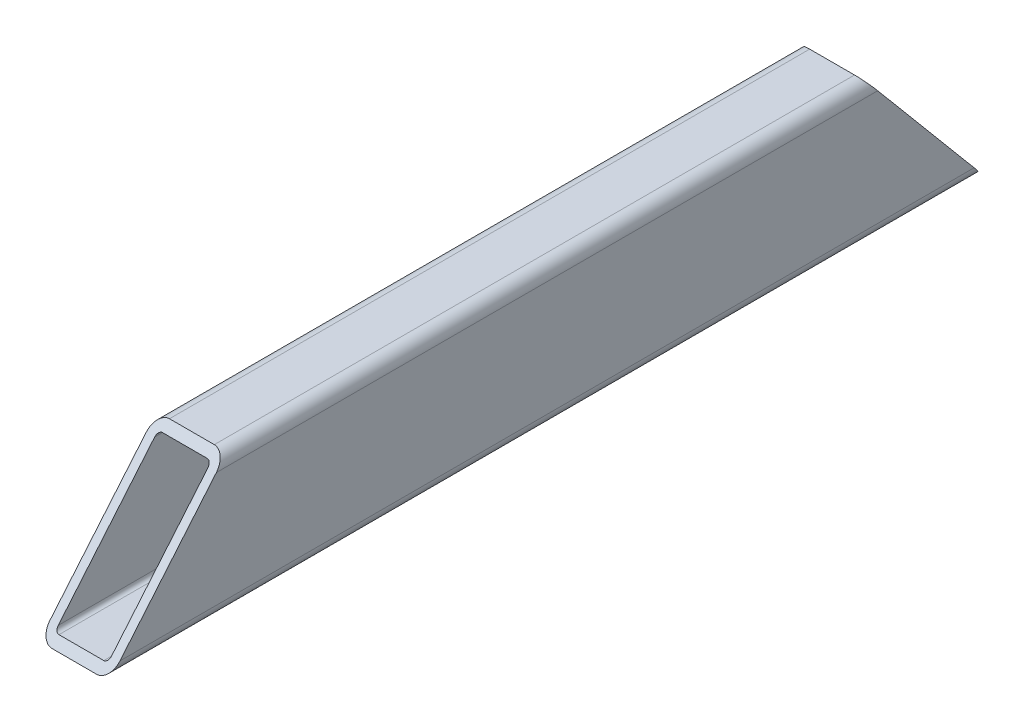
ISO-10303-21;
HEADER;
FILE_DESCRIPTION(('STEP AP214'),'2;1');
FILE_NAME('part.step','',(''),(''),'','','');
FILE_SCHEMA(('AUTOMOTIVE_DESIGN { 1 0 10303 214 1 1 1 1 }'));
ENDSEC;
DATA;
#1=APPLICATION_CONTEXT('core data for automotive mechanical design processes');
#2=APPLICATION_PROTOCOL_DEFINITION('international standard','automotive_design',2000,#1);
#3=PRODUCT_CONTEXT('',#1,'mechanical');
#4=PRODUCT('Part','Part','',(#3));
#5=PRODUCT_RELATED_PRODUCT_CATEGORY('part','',(#4));
#6=PRODUCT_DEFINITION_FORMATION('','',#4);
#7=PRODUCT_DEFINITION_CONTEXT('part definition',#1,'design');
#8=PRODUCT_DEFINITION('design','',#6,#7);
#9=PRODUCT_DEFINITION_SHAPE('','',#8);
#10=(LENGTH_UNIT() NAMED_UNIT(*) SI_UNIT(.MILLI.,.METRE.));
#11=(NAMED_UNIT(*) PLANE_ANGLE_UNIT() SI_UNIT($,.RADIAN.));
#12=(NAMED_UNIT(*) SI_UNIT($,.STERADIAN.) SOLID_ANGLE_UNIT());
#13=UNCERTAINTY_MEASURE_WITH_UNIT(LENGTH_MEASURE(1.E-05),#10,'distance_accuracy_value','');
#14=(GEOMETRIC_REPRESENTATION_CONTEXT(3) GLOBAL_UNCERTAINTY_ASSIGNED_CONTEXT((#13)) GLOBAL_UNIT_ASSIGNED_CONTEXT((#10,
#11,#12)) REPRESENTATION_CONTEXT('',''));
#15=CARTESIAN_POINT('',(0.,0.,0.));
#16=DIRECTION('',(0.,0.,1.));
#17=DIRECTION('',(1.,0.,0.));
#18=AXIS2_PLACEMENT_3D('',#15,#16,#17);
#19=CARTESIAN_POINT('',(-16.,41.,0.));
#20=DIRECTION('',(0.,0.,1.));
#21=DIRECTION('',(0.,-1.,0.));
#22=AXIS2_PLACEMENT_3D('',#19,#20,#21);
#23=CYLINDRICAL_SURFACE('',#22,3.);
#24=CARTESIAN_POINT('',(-16.,41.,571.606255596942));
#25=DIRECTION('',(0.,0.642787609686539,0.766044443118978));
#26=DIRECTION('',(0.,-0.766044443118978,0.642787609686539));
#27=AXIS2_PLACEMENT_3D('',#24,#25,#26);
#28=ELLIPSE('',#27,3.91622186799684,3.);
#29=CARTESIAN_POINT('',(-16.,44.,569.08895670341));
#30=VERTEX_POINT('',#29);
#31=CARTESIAN_POINT('',(-19.,41.,571.606255596942));
#32=VERTEX_POINT('',#31);
#33=EDGE_CURVE('E325',#30,#32,#28,.T.);
#34=ORIENTED_EDGE('',*,*,#33,.T.);
#35=DIRECTION('',(0.,0.,1.));
#36=VECTOR('',#35,1.);
#37=CARTESIAN_POINT('',(-19.,41.,0.));
#38=LINE('',#37,#36);
#39=CARTESIAN_POINT('',(-19.,41.,99.673449344883));
#40=VERTEX_POINT('',#39);
#41=EDGE_CURVE('E11',#40,#32,#38,.T.);
#42=ORIENTED_EDGE('',*,*,#41,.F.);
#43=CARTESIAN_POINT('',(-16.,41.,99.673449344883));
#44=DIRECTION('',(0.,0.64278760968654,-0.766044443118978));
#45=DIRECTION('',(0.,-0.766044443118978,-0.64278760968654));
#46=AXIS2_PLACEMENT_3D('',#43,#44,#45);
#47=ELLIPSE('',#46,3.91622186799684,3.);
#48=CARTESIAN_POINT('',(-16.,44.,102.190748238415));
#49=VERTEX_POINT('',#48);
#50=EDGE_CURVE('E255',#40,#49,#47,.T.);
#51=ORIENTED_EDGE('',*,*,#50,.T.);
#52=DIRECTION('',(0.,0.,1.));
#53=VECTOR('',#52,1.);
#54=CARTESIAN_POINT('',(-16.,44.,0.));
#55=LINE('',#54,#53);
#56=EDGE_CURVE('E139',#49,#30,#55,.T.);
#57=ORIENTED_EDGE('',*,*,#56,.T.);
#58=EDGE_LOOP('',(#34,#42,#51,#57));
#59=FACE_BOUND('',#58,.T.);
#60=ADVANCED_FACE('F17',(#59),#23,.F.);
#61=CARTESIAN_POINT('',(-19.,-41.,0.));
#62=DIRECTION('',(-1.,0.,0.));
#63=DIRECTION('',(0.,1.,0.));
#64=AXIS2_PLACEMENT_3D('',#61,#62,#63);
#65=PLANE('',#64);
#66=DIRECTION('',(0.,-0.766044443118978,0.642787609686539));
#67=VECTOR('',#66,1.);
#68=CARTESIAN_POINT('',(-19.,286.371454627815,365.715158517309));
#69=LINE('',#68,#67);
#70=CARTESIAN_POINT('',(-19.,-41.,640.412425353479));
#71=VERTEX_POINT('',#70);
#72=EDGE_CURVE('E227',#32,#71,#69,.T.);
#73=ORIENTED_EDGE('',*,*,#72,.T.);
#74=DIRECTION('',(0.,0.,1.));
#75=VECTOR('',#74,1.);
#76=CARTESIAN_POINT('',(-19.,-41.,0.));
#77=LINE('',#76,#75);
#78=CARTESIAN_POINT('',(-19.,-41.,30.867279588346));
#79=VERTEX_POINT('',#78);
#80=EDGE_CURVE('E28',#79,#71,#77,.T.);
#81=ORIENTED_EDGE('',*,*,#80,.F.);
#82=DIRECTION('',(0.,0.766044443118978,0.64278760968654));
#83=VECTOR('',#82,1.);
#84=CARTESIAN_POINT('',(-19.,-44.1692743054133,28.2079426875741));
#85=LINE('',#84,#83);
#86=EDGE_CURVE('E251',#79,#40,#85,.T.);
#87=ORIENTED_EDGE('',*,*,#86,.T.);
#88=ORIENTED_EDGE('',*,*,#41,.T.);
#89=EDGE_LOOP('',(#73,#81,#87,#88));
#90=FACE_BOUND('',#89,.T.);
#91=ADVANCED_FACE('F355',(#90),#65,.F.);
#92=CARTESIAN_POINT('',(-16.,-41.,0.));
#93=DIRECTION('',(0.,0.,1.));
#94=DIRECTION('',(1.,0.,0.));
#95=AXIS2_PLACEMENT_3D('',#92,#93,#94);
#96=CYLINDRICAL_SURFACE('',#95,3.);
#97=CARTESIAN_POINT('',(-16.,-41.,640.412425353479));
#98=DIRECTION('',(0.,0.642787609686539,0.766044443118978));
#99=DIRECTION('',(0.,0.766044443118978,-0.642787609686539));
#100=AXIS2_PLACEMENT_3D('',#97,#98,#99);
#101=ELLIPSE('',#100,3.91622186799684,3.);
#102=CARTESIAN_POINT('',(-16.,-44.,642.92972424701));
#103=VERTEX_POINT('',#102);
#104=EDGE_CURVE('E224',#71,#103,#101,.T.);
#105=ORIENTED_EDGE('',*,*,#104,.T.);
#106=DIRECTION('',(0.,0.,1.));
#107=VECTOR('',#106,1.);
#108=CARTESIAN_POINT('',(-16.,-44.,0.));
#109=LINE('',#108,#107);
#110=CARTESIAN_POINT('',(-16.,-44.,28.3499806948141));
#111=VERTEX_POINT('',#110);
#112=EDGE_CURVE('E233',#111,#103,#109,.T.);
#113=ORIENTED_EDGE('',*,*,#112,.F.);
#114=CARTESIAN_POINT('',(-16.,-41.,30.867279588346));
#115=DIRECTION('',(0.,0.64278760968654,-0.766044443118978));
#116=DIRECTION('',(0.,0.766044443118978,0.64278760968654));
#117=AXIS2_PLACEMENT_3D('',#114,#115,#116);
#118=ELLIPSE('',#117,3.91622186799684,3.);
#119=EDGE_CURVE('E254',#111,#79,#118,.T.);
#120=ORIENTED_EDGE('',*,*,#119,.T.);
#121=ORIENTED_EDGE('',*,*,#80,.T.);
#122=EDGE_LOOP('',(#105,#113,#120,#121));
#123=FACE_BOUND('',#122,.T.);
#124=ADVANCED_FACE('F360',(#123),#96,.F.);
#125=CARTESIAN_POINT('',(16.,-50.,0.));
#126=DIRECTION('',(0.,-1.,0.));
#127=DIRECTION('',(0.,0.,-1.));
#128=AXIS2_PLACEMENT_3D('',#125,#126,#127);
#129=PLANE('',#128);
#130=DIRECTION('',(-1.,0.,0.));
#131=VECTOR('',#130,1.);
#132=CARTESIAN_POINT('',(8.,-50.,647.96432203));
#133=LINE('',#132,#131);
#134=CARTESIAN_POINT('',(16.,-50.,647.96432203));
#135=VERTEX_POINT('',#134);
#136=CARTESIAN_POINT('',(-16.,-50.,647.96432203));
#137=VERTEX_POINT('',#136);
#138=EDGE_CURVE('E241',#135,#137,#133,.T.);
#139=ORIENTED_EDGE('',*,*,#138,.T.);
#140=DIRECTION('',(0.,0.,1.));
#141=VECTOR('',#140,1.);
#142=CARTESIAN_POINT('',(-16.,-50.,0.));
#143=LINE('',#142,#141);
#144=CARTESIAN_POINT('',(-16.,-50.,23.31538291));
#145=VERTEX_POINT('',#144);
#146=EDGE_CURVE('E284',#145,#137,#143,.T.);
#147=ORIENTED_EDGE('',*,*,#146,.F.);
#148=DIRECTION('',(-1.,0.,0.));
#149=VECTOR('',#148,1.);
#150=CARTESIAN_POINT('',(8.,-50.,23.31538291));
#151=LINE('',#150,#149);
#152=CARTESIAN_POINT('',(16.,-50.,23.31538291));
#153=VERTEX_POINT('',#152);
#154=EDGE_CURVE('E222',#153,#145,#151,.T.);
#155=ORIENTED_EDGE('',*,*,#154,.F.);
#156=DIRECTION('',(0.,0.,1.));
#157=VECTOR('',#156,1.);
#158=CARTESIAN_POINT('',(16.,-50.,0.));
#159=LINE('',#158,#157);
#160=EDGE_CURVE('E287',#153,#135,#159,.T.);
#161=ORIENTED_EDGE('',*,*,#160,.T.);
#162=EDGE_LOOP('',(#139,#147,#155,#161));
#163=FACE_BOUND('',#162,.T.);
#164=ADVANCED_FACE('F513',(#163),#129,.T.);
#165=CARTESIAN_POINT('',(16.,-41.,0.));
#166=DIRECTION('',(0.,0.,1.));
#167=DIRECTION('',(0.,1.,0.));
#168=AXIS2_PLACEMENT_3D('',#165,#166,#167);
#169=CYLINDRICAL_SURFACE('',#168,9.);
#170=CARTESIAN_POINT('',(16.,-41.,640.412425353479));
#171=DIRECTION('',(0.,-0.642787609686539,-0.766044443118978));
#172=DIRECTION('',(0.,0.766044443118978,-0.642787609686539));
#173=AXIS2_PLACEMENT_3D('',#170,#171,#172);
#174=ELLIPSE('',#173,11.7486656039905,9.);
#175=CARTESIAN_POINT('',(25.,-41.,640.412425353479));
#176=VERTEX_POINT('',#175);
#177=EDGE_CURVE('E283',#176,#135,#174,.T.);
#178=ORIENTED_EDGE('',*,*,#177,.T.);
#179=ORIENTED_EDGE('',*,*,#160,.F.);
#180=CARTESIAN_POINT('',(16.,-41.,30.867279588346));
#181=DIRECTION('',(0.,-0.64278760968654,0.766044443118978));
#182=DIRECTION('',(0.,0.766044443118978,0.64278760968654));
#183=AXIS2_PLACEMENT_3D('',#180,#181,#182);
#184=ELLIPSE('',#183,11.7486656039905,9.);
#185=CARTESIAN_POINT('',(25.,-41.,30.867279588346));
#186=VERTEX_POINT('',#185);
#187=EDGE_CURVE('E219',#153,#186,#184,.T.);
#188=ORIENTED_EDGE('',*,*,#187,.T.);
#189=DIRECTION('',(0.,0.,1.));
#190=VECTOR('',#189,1.);
#191=CARTESIAN_POINT('',(25.,-41.,0.));
#192=LINE('',#191,#190);
#193=EDGE_CURVE('E192',#186,#176,#192,.T.);
#194=ORIENTED_EDGE('',*,*,#193,.T.);
#195=EDGE_LOOP('',(#178,#179,#188,#194));
#196=FACE_BOUND('',#195,.T.);
#197=ADVANCED_FACE('F551',(#196),#169,.T.);
#198=CARTESIAN_POINT('',(-16.,-41.,0.));
#199=DIRECTION('',(0.,0.,1.));
#200=DIRECTION('',(1.,0.,0.));
#201=AXIS2_PLACEMENT_3D('',#198,#199,#200);
#202=CYLINDRICAL_SURFACE('',#201,9.);
#203=CARTESIAN_POINT('',(-16.,-41.,640.412425353479));
#204=DIRECTION('',(0.,-0.642787609686539,-0.766044443118978));
#205=DIRECTION('',(0.,0.766044443118978,-0.642787609686539));
#206=AXIS2_PLACEMENT_3D('',#203,#204,#205);
#207=ELLIPSE('',#206,11.7486656039905,9.);
#208=CARTESIAN_POINT('',(-25.,-41.,640.412425353479));
#209=VERTEX_POINT('',#208);
#210=EDGE_CURVE('E217',#137,#209,#207,.T.);
#211=ORIENTED_EDGE('',*,*,#210,.T.);
#212=DIRECTION('',(0.,0.,1.));
#213=VECTOR('',#212,1.);
#214=CARTESIAN_POINT('',(-25.,-41.,0.));
#215=LINE('',#214,#213);
#216=CARTESIAN_POINT('',(-25.,-41.,30.867279588346));
#217=VERTEX_POINT('',#216);
#218=EDGE_CURVE('E288',#217,#209,#215,.T.);
#219=ORIENTED_EDGE('',*,*,#218,.F.);
#220=CARTESIAN_POINT('',(-16.,-41.,30.867279588346));
#221=DIRECTION('',(0.,-0.64278760968654,0.766044443118978));
#222=DIRECTION('',(0.,0.766044443118978,0.64278760968654));
#223=AXIS2_PLACEMENT_3D('',#220,#221,#222);
#224=ELLIPSE('',#223,11.7486656039905,9.);
#225=EDGE_CURVE('E293',#217,#145,#224,.T.);
#226=ORIENTED_EDGE('',*,*,#225,.T.);
#227=ORIENTED_EDGE('',*,*,#146,.T.);
#228=EDGE_LOOP('',(#211,#219,#226,#227));
#229=FACE_BOUND('',#228,.T.);
#230=ADVANCED_FACE('F508',(#229),#202,.T.);
#231=CARTESIAN_POINT('',(-25.,-41.,0.));
#232=DIRECTION('',(-1.,0.,0.));
#233=DIRECTION('',(0.,1.,0.));
#234=AXIS2_PLACEMENT_3D('',#231,#232,#233);
#235=PLANE('',#234);
#236=DIRECTION('',(0.,0.766044443118978,-0.642787609686539));
#237=VECTOR('',#236,1.);
#238=CARTESIAN_POINT('',(-25.,286.371454627815,365.715158517309));
#239=LINE('',#238,#237);
#240=CARTESIAN_POINT('',(-25.,41.,571.606255596942));
#241=VERTEX_POINT('',#240);
#242=EDGE_CURVE('E259',#209,#241,#239,.T.);
#243=ORIENTED_EDGE('',*,*,#242,.T.);
#244=DIRECTION('',(0.,0.,1.));
#245=VECTOR('',#244,1.);
#246=CARTESIAN_POINT('',(-25.,41.,0.));
#247=LINE('',#246,#245);
#248=CARTESIAN_POINT('',(-25.,41.,99.673449344883));
#249=VERTEX_POINT('',#248);
#250=EDGE_CURVE('E208',#249,#241,#247,.T.);
#251=ORIENTED_EDGE('',*,*,#250,.F.);
#252=DIRECTION('',(0.,-0.766044443118978,-0.64278760968654));
#253=VECTOR('',#252,1.);
#254=CARTESIAN_POINT('',(-25.,-44.1692743054133,28.2079426875741));
#255=LINE('',#254,#253);
#256=EDGE_CURVE('E289',#249,#217,#255,.T.);
#257=ORIENTED_EDGE('',*,*,#256,.T.);
#258=ORIENTED_EDGE('',*,*,#218,.T.);
#259=EDGE_LOOP('',(#243,#251,#257,#258));
#260=FACE_BOUND('',#259,.T.);
#261=ADVANCED_FACE('F520',(#260),#235,.T.);
#262=CARTESIAN_POINT('',(-16.,44.,0.));
#263=DIRECTION('',(0.,1.,0.));
#264=DIRECTION('',(1.,0.,0.));
#265=AXIS2_PLACEMENT_3D('',#262,#263,#264);
#266=PLANE('',#265);
#267=DIRECTION('',(-1.,0.,0.));
#268=VECTOR('',#267,1.);
#269=CARTESIAN_POINT('',(-8.00000000000069,44.,569.08895670341));
#270=LINE('',#269,#268);
#271=CARTESIAN_POINT('',(16.,44.,569.08895670341));
#272=VERTEX_POINT('',#271);
#273=EDGE_CURVE('E245',#272,#30,#270,.T.);
#274=ORIENTED_EDGE('',*,*,#273,.T.);
#275=ORIENTED_EDGE('',*,*,#56,.F.);
#276=DIRECTION('',(1.,0.,0.));
#277=VECTOR('',#276,1.);
#278=CARTESIAN_POINT('',(-8.,44.,102.190748238415));
#279=LINE('',#278,#277);
#280=CARTESIAN_POINT('',(16.,44.,102.190748238415));
#281=VERTEX_POINT('',#280);
#282=EDGE_CURVE('E277',#49,#281,#279,.T.);
#283=ORIENTED_EDGE('',*,*,#282,.T.);
#284=DIRECTION('',(0.,0.,1.));
#285=VECTOR('',#284,1.);
#286=CARTESIAN_POINT('',(16.,44.,0.));
#287=LINE('',#286,#285);
#288=EDGE_CURVE('E246',#281,#272,#287,.T.);
#289=ORIENTED_EDGE('',*,*,#288,.T.);
#290=EDGE_LOOP('',(#274,#275,#283,#289));
#291=FACE_BOUND('',#290,.T.);
#292=ADVANCED_FACE('F337',(#291),#266,.F.);
#293=CARTESIAN_POINT('',(0.,-32.1393804843273,38.3022221559492));
#294=DIRECTION('',(0.,-0.64278760968654,0.766044443118978));
#295=DIRECTION('',(-1.,0.,0.));
#296=AXIS2_PLACEMENT_3D('',#293,#294,#295);
#297=PLANE('',#296);
#298=DIRECTION('',(-1.,0.,0.));
#299=VECTOR('',#298,1.);
#300=CARTESIAN_POINT('',(8.,-44.,28.3499806948141));
#301=LINE('',#300,#299);
#302=CARTESIAN_POINT('',(16.,-44.,28.3499806948141));
#303=VERTEX_POINT('',#302);
#304=EDGE_CURVE('E229',#303,#111,#301,.T.);
#305=ORIENTED_EDGE('',*,*,#304,.F.);
#306=CARTESIAN_POINT('',(16.,-41.,30.867279588346));
#307=DIRECTION('',(0.,0.64278760968654,-0.766044443118978));
#308=DIRECTION('',(0.,0.766044443118978,0.64278760968654));
#309=AXIS2_PLACEMENT_3D('',#306,#307,#308);
#310=ELLIPSE('',#309,3.91622186799684,3.);
#311=CARTESIAN_POINT('',(19.,-41.,30.867279588346));
#312=VERTEX_POINT('',#311);
#313=EDGE_CURVE('E256',#312,#303,#310,.T.);
#314=ORIENTED_EDGE('',*,*,#313,.F.);
#315=DIRECTION('',(0.,-0.766044443118978,-0.64278760968654));
#316=VECTOR('',#315,1.);
#317=CARTESIAN_POINT('',(19.,-20.1094866632412,48.3965016243243));
#318=LINE('',#317,#316);
#319=CARTESIAN_POINT('',(19.,41.,99.673449344883));
#320=VERTEX_POINT('',#319);
#321=EDGE_CURVE('E249',#320,#312,#318,.T.);
#322=ORIENTED_EDGE('',*,*,#321,.F.);
#323=CARTESIAN_POINT('',(16.,41.,99.673449344883));
#324=DIRECTION('',(0.,0.64278760968654,-0.766044443118978));
#325=DIRECTION('',(0.,-0.766044443118978,-0.64278760968654));
#326=AXIS2_PLACEMENT_3D('',#323,#324,#325);
#327=ELLIPSE('',#326,3.91622186799684,3.);
#328=EDGE_CURVE('E248',#281,#320,#327,.T.);
#329=ORIENTED_EDGE('',*,*,#328,.F.);
#330=ORIENTED_EDGE('',*,*,#282,.F.);
#331=ORIENTED_EDGE('',*,*,#50,.F.);
#332=ORIENTED_EDGE('',*,*,#86,.F.);
#333=ORIENTED_EDGE('',*,*,#119,.F.);
#334=EDGE_LOOP('',(#305,#314,#322,#329,#330,#331,#332,#333));
#335=FACE_BOUND('',#334,.T.);
#336=DIRECTION('',(0.,0.766044443118978,0.64278760968654));
#337=VECTOR('',#336,1.);
#338=CARTESIAN_POINT('',(25.,-20.1094866632412,48.3965016243243));
#339=LINE('',#338,#337);
#340=CARTESIAN_POINT('',(25.,41.,99.673449344883));
#341=VERTEX_POINT('',#340);
#342=EDGE_CURVE('E223',#186,#341,#339,.T.);
#343=ORIENTED_EDGE('',*,*,#342,.F.);
#344=ORIENTED_EDGE('',*,*,#187,.F.);
#345=ORIENTED_EDGE('',*,*,#154,.T.);
#346=ORIENTED_EDGE('',*,*,#225,.F.);
#347=ORIENTED_EDGE('',*,*,#256,.F.);
#348=CARTESIAN_POINT('',(-16.,41.,99.673449344883));
#349=DIRECTION('',(0.,-0.64278760968654,0.766044443118978));
#350=DIRECTION('',(0.,-0.766044443118978,-0.64278760968654));
#351=AXIS2_PLACEMENT_3D('',#348,#349,#350);
#352=ELLIPSE('',#351,11.7486656039905,9.);
#353=CARTESIAN_POINT('',(-16.,50.,107.225346025479));
#354=VERTEX_POINT('',#353);
#355=EDGE_CURVE('E199',#354,#249,#352,.T.);
#356=ORIENTED_EDGE('',*,*,#355,.F.);
#357=DIRECTION('',(-1.,0.,0.));
#358=VECTOR('',#357,1.);
#359=CARTESIAN_POINT('',(-8.,50.,107.225346025479));
#360=LINE('',#359,#358);
#361=CARTESIAN_POINT('',(16.,50.,107.225346025479));
#362=VERTEX_POINT('',#361);
#363=EDGE_CURVE('E196',#362,#354,#360,.T.);
#364=ORIENTED_EDGE('',*,*,#363,.F.);
#365=CARTESIAN_POINT('',(16.,41.,99.673449344883));
#366=DIRECTION('',(0.,-0.64278760968654,0.766044443118978));
#367=DIRECTION('',(0.,-0.766044443118978,-0.64278760968654));
#368=AXIS2_PLACEMENT_3D('',#365,#366,#367);
#369=ELLIPSE('',#368,11.7486656039905,9.);
#370=EDGE_CURVE('E181',#341,#362,#369,.T.);
#371=ORIENTED_EDGE('',*,*,#370,.F.);
#372=EDGE_LOOP('',(#343,#344,#345,#346,#347,#356,#364,#371));
#373=FACE_BOUND('',#372,.T.);
#374=ADVANCED_FACE('F197',(#335,#373),#297,.F.);
#375=CARTESIAN_POINT('',(25.,41.,0.));
#376=DIRECTION('',(1.,0.,0.));
#377=DIRECTION('',(0.,1.,0.));
#378=AXIS2_PLACEMENT_3D('',#375,#376,#377);
#379=PLANE('',#378);
#380=DIRECTION('',(0.,-0.766044443118978,0.642787609686539));
#381=VECTOR('',#380,1.);
#382=CARTESIAN_POINT('',(25.,310.431242269987,345.526599580559));
#383=LINE('',#382,#381);
#384=CARTESIAN_POINT('',(25.,41.,571.606255596942));
#385=VERTEX_POINT('',#384);
#386=EDGE_CURVE('E238',#385,#176,#383,.T.);
#387=ORIENTED_EDGE('',*,*,#386,.T.);
#388=ORIENTED_EDGE('',*,*,#193,.F.);
#389=ORIENTED_EDGE('',*,*,#342,.T.);
#390=DIRECTION('',(0.,0.,1.));
#391=VECTOR('',#390,1.);
#392=CARTESIAN_POINT('',(25.,41.,0.));
#393=LINE('',#392,#391);
#394=EDGE_CURVE('E188',#341,#385,#393,.T.);
#395=ORIENTED_EDGE('',*,*,#394,.T.);
#396=EDGE_LOOP('',(#387,#388,#389,#395));
#397=FACE_BOUND('',#396,.T.);
#398=ADVANCED_FACE('F545',(#397),#379,.T.);
#399=CARTESIAN_POINT('',(16.,41.,0.));
#400=DIRECTION('',(0.,0.,1.));
#401=DIRECTION('',(-1.,0.,0.));
#402=AXIS2_PLACEMENT_3D('',#399,#400,#401);
#403=CYLINDRICAL_SURFACE('',#402,9.);
#404=CARTESIAN_POINT('',(16.,41.,571.606255596942));
#405=DIRECTION('',(0.,-0.642787609686539,-0.766044443118978));
#406=DIRECTION('',(0.,-0.766044443118978,0.642787609686539));
#407=AXIS2_PLACEMENT_3D('',#404,#405,#406);
#408=ELLIPSE('',#407,11.7486656039905,9.);
#409=CARTESIAN_POINT('',(16.,50.,564.054358916346));
#410=VERTEX_POINT('',#409);
#411=EDGE_CURVE('E235',#410,#385,#408,.T.);
#412=ORIENTED_EDGE('',*,*,#411,.T.);
#413=ORIENTED_EDGE('',*,*,#394,.F.);
#414=ORIENTED_EDGE('',*,*,#370,.T.);
#415=DIRECTION('',(0.,0.,1.));
#416=VECTOR('',#415,1.);
#417=CARTESIAN_POINT('',(16.,50.,0.));
#418=LINE('',#417,#416);
#419=EDGE_CURVE('E186',#362,#410,#418,.T.);
#420=ORIENTED_EDGE('',*,*,#419,.T.);
#421=EDGE_LOOP('',(#412,#413,#414,#420));
#422=FACE_BOUND('',#421,.T.);
#423=ADVANCED_FACE('F184',(#422),#403,.T.);
#424=CARTESIAN_POINT('',(-16.,50.,0.));
#425=DIRECTION('',(0.,1.,0.));
#426=DIRECTION('',(1.,0.,0.));
#427=AXIS2_PLACEMENT_3D('',#424,#425,#426);
#428=PLANE('',#427);
#429=DIRECTION('',(1.,0.,0.));
#430=VECTOR('',#429,1.);
#431=CARTESIAN_POINT('',(-8.00000000000081,50.,564.054358916346));
#432=LINE('',#431,#430);
#433=CARTESIAN_POINT('',(-16.,50.,564.054358916346));
#434=VERTEX_POINT('',#433);
#435=EDGE_CURVE('E205',#434,#410,#432,.T.);
#436=ORIENTED_EDGE('',*,*,#435,.T.);
#437=ORIENTED_EDGE('',*,*,#419,.F.);
#438=ORIENTED_EDGE('',*,*,#363,.T.);
#439=DIRECTION('',(0.,0.,1.));
#440=VECTOR('',#439,1.);
#441=CARTESIAN_POINT('',(-16.,50.,0.));
#442=LINE('',#441,#440);
#443=EDGE_CURVE('E298',#354,#434,#442,.T.);
#444=ORIENTED_EDGE('',*,*,#443,.T.);
#445=EDGE_LOOP('',(#436,#437,#438,#444));
#446=FACE_BOUND('',#445,.T.);
#447=ADVANCED_FACE('F19',(#446),#428,.T.);
#448=CARTESIAN_POINT('',(-16.,41.,0.));
#449=DIRECTION('',(0.,0.,1.));
#450=DIRECTION('',(0.,-1.,0.));
#451=AXIS2_PLACEMENT_3D('',#448,#449,#450);
#452=CYLINDRICAL_SURFACE('',#451,9.);
#453=CARTESIAN_POINT('',(-16.,41.,571.606255596942));
#454=DIRECTION('',(0.,-0.642787609686539,-0.766044443118978));
#455=DIRECTION('',(0.,-0.766044443118978,0.642787609686539));
#456=AXIS2_PLACEMENT_3D('',#453,#454,#455);
#457=ELLIPSE('',#456,11.7486656039905,9.);
#458=EDGE_CURVE('E262',#241,#434,#457,.T.);
#459=ORIENTED_EDGE('',*,*,#458,.T.);
#460=ORIENTED_EDGE('',*,*,#443,.F.);
#461=ORIENTED_EDGE('',*,*,#355,.T.);
#462=ORIENTED_EDGE('',*,*,#250,.T.);
#463=EDGE_LOOP('',(#459,#460,#461,#462));
#464=FACE_BOUND('',#463,.T.);
#465=ADVANCED_FACE('F522',(#464),#452,.T.);
#466=CARTESIAN_POINT('',(16.,41.,0.));
#467=DIRECTION('',(0.,0.,1.));
#468=DIRECTION('',(-1.,0.,0.));
#469=AXIS2_PLACEMENT_3D('',#466,#467,#468);
#470=CYLINDRICAL_SURFACE('',#469,3.);
#471=CARTESIAN_POINT('',(16.,41.,571.606255596942));
#472=DIRECTION('',(0.,0.642787609686539,0.766044443118978));
#473=DIRECTION('',(0.,-0.766044443118978,0.642787609686539));
#474=AXIS2_PLACEMENT_3D('',#471,#472,#473);
#475=ELLIPSE('',#474,3.91622186799684,3.);
#476=CARTESIAN_POINT('',(19.,41.,571.606255596942));
#477=VERTEX_POINT('',#476);
#478=EDGE_CURVE('E319',#477,#272,#475,.T.);
#479=ORIENTED_EDGE('',*,*,#478,.T.);
#480=ORIENTED_EDGE('',*,*,#288,.F.);
#481=ORIENTED_EDGE('',*,*,#328,.T.);
#482=DIRECTION('',(0.,0.,1.));
#483=VECTOR('',#482,1.);
#484=CARTESIAN_POINT('',(19.,41.,0.));
#485=LINE('',#484,#483);
#486=EDGE_CURVE('E129',#320,#477,#485,.T.);
#487=ORIENTED_EDGE('',*,*,#486,.T.);
#488=EDGE_LOOP('',(#479,#480,#481,#487));
#489=FACE_BOUND('',#488,.T.);
#490=ADVANCED_FACE('F342',(#489),#470,.F.);
#491=CARTESIAN_POINT('',(19.,41.,0.));
#492=DIRECTION('',(1.,0.,0.));
#493=DIRECTION('',(0.,1.,0.));
#494=AXIS2_PLACEMENT_3D('',#491,#492,#493);
#495=PLANE('',#494);
#496=DIRECTION('',(0.,0.766044443118978,-0.642787609686539));
#497=VECTOR('',#496,1.);
#498=CARTESIAN_POINT('',(19.,310.431242269987,345.526599580559));
#499=LINE('',#498,#497);
#500=CARTESIAN_POINT('',(19.,-41.,640.412425353479));
#501=VERTEX_POINT('',#500);
#502=EDGE_CURVE('E348',#501,#477,#499,.T.);
#503=ORIENTED_EDGE('',*,*,#502,.T.);
#504=ORIENTED_EDGE('',*,*,#486,.F.);
#505=ORIENTED_EDGE('',*,*,#321,.T.);
#506=DIRECTION('',(0.,0.,1.));
#507=VECTOR('',#506,1.);
#508=CARTESIAN_POINT('',(19.,-41.,0.));
#509=LINE('',#508,#507);
#510=EDGE_CURVE('E119',#312,#501,#509,.T.);
#511=ORIENTED_EDGE('',*,*,#510,.T.);
#512=EDGE_LOOP('',(#503,#504,#505,#511));
#513=FACE_BOUND('',#512,.T.);
#514=ADVANCED_FACE('F530',(#513),#495,.F.);
#515=CARTESIAN_POINT('',(16.,-41.,0.));
#516=DIRECTION('',(0.,0.,1.));
#517=DIRECTION('',(0.,1.,0.));
#518=AXIS2_PLACEMENT_3D('',#515,#516,#517);
#519=CYLINDRICAL_SURFACE('',#518,3.);
#520=CARTESIAN_POINT('',(16.,-41.,640.412425353479));
#521=DIRECTION('',(0.,0.642787609686539,0.766044443118978));
#522=DIRECTION('',(0.,0.766044443118978,-0.642787609686539));
#523=AXIS2_PLACEMENT_3D('',#520,#521,#522);
#524=ELLIPSE('',#523,3.91622186799684,3.);
#525=CARTESIAN_POINT('',(16.,-44.,642.92972424701));
#526=VERTEX_POINT('',#525);
#527=EDGE_CURVE('E21',#526,#501,#524,.T.);
#528=ORIENTED_EDGE('',*,*,#527,.T.);
#529=ORIENTED_EDGE('',*,*,#510,.F.);
#530=ORIENTED_EDGE('',*,*,#313,.T.);
#531=DIRECTION('',(0.,0.,1.));
#532=VECTOR('',#531,1.);
#533=CARTESIAN_POINT('',(16.,-44.,0.));
#534=LINE('',#533,#532);
#535=EDGE_CURVE('E234',#303,#526,#534,.T.);
#536=ORIENTED_EDGE('',*,*,#535,.T.);
#537=EDGE_LOOP('',(#528,#529,#530,#536));
#538=FACE_BOUND('',#537,.T.);
#539=ADVANCED_FACE('F563',(#538),#519,.F.);
#540=CARTESIAN_POINT('',(16.,-44.,0.));
#541=DIRECTION('',(0.,-1.,0.));
#542=DIRECTION('',(0.,0.,-1.));
#543=AXIS2_PLACEMENT_3D('',#540,#541,#542);
#544=PLANE('',#543);
#545=DIRECTION('',(1.,0.,0.));
#546=VECTOR('',#545,1.);
#547=CARTESIAN_POINT('',(7.99999999999909,-44.,642.92972424701));
#548=LINE('',#547,#546);
#549=EDGE_CURVE('E228',#103,#526,#548,.T.);
#550=ORIENTED_EDGE('',*,*,#549,.T.);
#551=ORIENTED_EDGE('',*,*,#535,.F.);
#552=ORIENTED_EDGE('',*,*,#304,.T.);
#553=ORIENTED_EDGE('',*,*,#112,.T.);
#554=EDGE_LOOP('',(#550,#551,#552,#553));
#555=FACE_BOUND('',#554,.T.);
#556=ADVANCED_FACE('F364',(#555),#544,.F.);
#557=CARTESIAN_POINT('',(-5.05347450687654E-13,298.401348448901,355.620879048934));
#558=DIRECTION('',(0.,-0.642787609686539,-0.766044443118978));
#559=DIRECTION('',(0.,-0.766044443118978,0.642787609686539));
#560=AXIS2_PLACEMENT_3D('',#557,#558,#559);
#561=PLANE('',#560);
#562=ORIENTED_EDGE('',*,*,#273,.F.);
#563=ORIENTED_EDGE('',*,*,#478,.F.);
#564=ORIENTED_EDGE('',*,*,#502,.F.);
#565=ORIENTED_EDGE('',*,*,#527,.F.);
#566=ORIENTED_EDGE('',*,*,#549,.F.);
#567=ORIENTED_EDGE('',*,*,#104,.F.);
#568=ORIENTED_EDGE('',*,*,#72,.F.);
#569=ORIENTED_EDGE('',*,*,#33,.F.);
#570=EDGE_LOOP('',(#562,#563,#564,#565,#566,#567,#568,#569));
#571=FACE_BOUND('',#570,.T.);
#572=ORIENTED_EDGE('',*,*,#177,.F.);
#573=ORIENTED_EDGE('',*,*,#386,.F.);
#574=ORIENTED_EDGE('',*,*,#411,.F.);
#575=ORIENTED_EDGE('',*,*,#435,.F.);
#576=ORIENTED_EDGE('',*,*,#458,.F.);
#577=ORIENTED_EDGE('',*,*,#242,.F.);
#578=ORIENTED_EDGE('',*,*,#210,.F.);
#579=ORIENTED_EDGE('',*,*,#138,.F.);
#580=EDGE_LOOP('',(#572,#573,#574,#575,#576,#577,#578,#579));
#581=FACE_BOUND('',#580,.T.);
#582=ADVANCED_FACE('F350',(#571,#581),#561,.F.);
#583=CLOSED_SHELL('',(#60,#91,#124,#164,#197,#230,#261,#292,#374,#398,#423,#447,#465,#490,#514,
#539,#556,#582));
#584=MANIFOLD_SOLID_BREP('B1',#583);
#585=ADVANCED_BREP_SHAPE_REPRESENTATION('',(#18,#584),#14);
#586=SHAPE_DEFINITION_REPRESENTATION(#9,#585);
ENDSEC;
END-ISO-10303-21;
